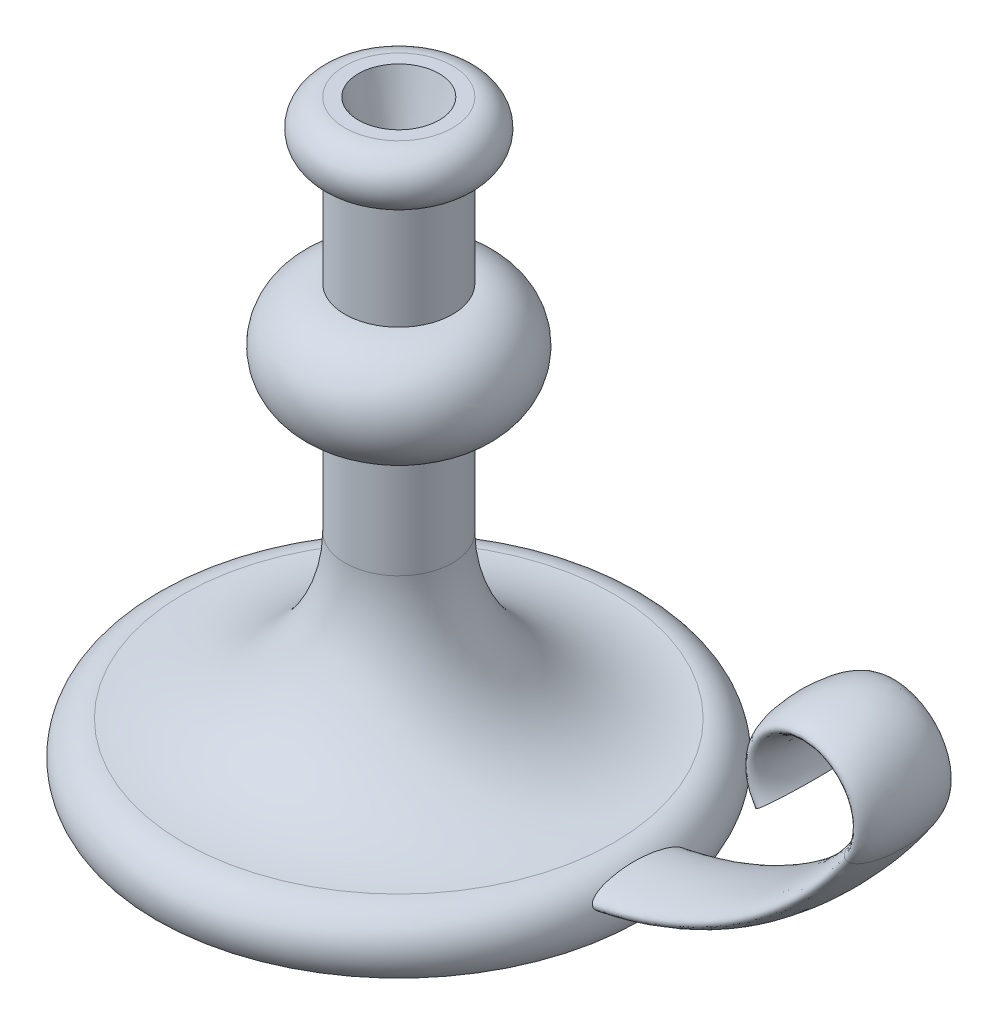
ISO-10303-21;
HEADER;
FILE_DESCRIPTION(('STEP AP214'),'2;1');
FILE_NAME('part.step','',(''),(''),'','','');
FILE_SCHEMA(('AUTOMOTIVE_DESIGN { 1 0 10303 214 1 1 1 1 }'));
ENDSEC;
DATA;
#1=APPLICATION_CONTEXT('core data for automotive mechanical design processes');
#2=APPLICATION_PROTOCOL_DEFINITION('international standard','automotive_design',2000,#1);
#3=PRODUCT_CONTEXT('',#1,'mechanical');
#4=PRODUCT('Part','Part','',(#3));
#5=PRODUCT_RELATED_PRODUCT_CATEGORY('part','',(#4));
#6=PRODUCT_DEFINITION_FORMATION('','',#4);
#7=PRODUCT_DEFINITION_CONTEXT('part definition',#1,'design');
#8=PRODUCT_DEFINITION('design','',#6,#7);
#9=PRODUCT_DEFINITION_SHAPE('','',#8);
#10=(LENGTH_UNIT() NAMED_UNIT(*) SI_UNIT(.MILLI.,.METRE.));
#11=(NAMED_UNIT(*) PLANE_ANGLE_UNIT() SI_UNIT($,.RADIAN.));
#12=(NAMED_UNIT(*) SI_UNIT($,.STERADIAN.) SOLID_ANGLE_UNIT());
#13=UNCERTAINTY_MEASURE_WITH_UNIT(LENGTH_MEASURE(1.E-05),#10,'distance_accuracy_value','');
#14=(GEOMETRIC_REPRESENTATION_CONTEXT(3) GLOBAL_UNCERTAINTY_ASSIGNED_CONTEXT((#13)) GLOBAL_UNIT_ASSIGNED_CONTEXT((#10,
#11,#12)) REPRESENTATION_CONTEXT('',''));
#15=CARTESIAN_POINT('',(0.,0.,0.));
#16=DIRECTION('',(0.,0.,1.));
#17=DIRECTION('',(1.,0.,0.));
#18=AXIS2_PLACEMENT_3D('',#15,#16,#17);
#19=CARTESIAN_POINT('',(0.,0.,0.));
#20=DIRECTION('',(0.,-1.,0.));
#21=DIRECTION('',(0.,0.,-1.));
#22=AXIS2_PLACEMENT_3D('',#19,#20,#21);
#23=PLANE('',#22);
#24=CARTESIAN_POINT('',(0.,0.,0.));
#25=DIRECTION('',(0.,1.,0.));
#26=DIRECTION('',(0.,0.,1.));
#27=AXIS2_PLACEMENT_3D('',#24,#25,#26);
#28=CIRCLE('',#27,15.);
#29=CARTESIAN_POINT('',(0.,0.,15.));
#30=VERTEX_POINT('',#29);
#31=EDGE_CURVE('E73',#30,#30,#28,.T.);
#32=ORIENTED_EDGE('',*,*,#31,.F.);
#33=EDGE_LOOP('',(#32));
#34=FACE_BOUND('',#33,.T.);
#35=CARTESIAN_POINT('',(0.,0.,0.));
#36=DIRECTION('',(0.,1.,0.));
#37=DIRECTION('',(0.,0.,1.));
#38=AXIS2_PLACEMENT_3D('',#35,#36,#37);
#39=CIRCLE('',#38,20.);
#40=CARTESIAN_POINT('',(0.,0.,20.));
#41=VERTEX_POINT('',#40);
#42=EDGE_CURVE('E10',#41,#41,#39,.T.);
#43=ORIENTED_EDGE('',*,*,#42,.T.);
#44=EDGE_LOOP('',(#43));
#45=FACE_BOUND('',#44,.T.);
#46=ADVANCED_FACE('F31',(#34,#45),#23,.F.);
#47=CARTESIAN_POINT('',(0.,-10.,0.));
#48=DIRECTION('',(0.,1.,0.));
#49=DIRECTION('',(0.,0.,1.));
#50=AXIS2_PLACEMENT_3D('',#47,#48,#49);
#51=TOROIDAL_SURFACE('',#50,20.,10.);
#52=ORIENTED_EDGE('',*,*,#42,.F.);
#53=EDGE_LOOP('',(#52));
#54=FACE_BOUND('',#53,.T.);
#55=CARTESIAN_POINT('',(0.,-20.,0.));
#56=DIRECTION('',(0.,1.,0.));
#57=DIRECTION('',(0.,0.,1.));
#58=AXIS2_PLACEMENT_3D('',#55,#56,#57);
#59=CIRCLE('',#58,20.);
#60=CARTESIAN_POINT('',(0.,-20.,20.));
#61=VERTEX_POINT('',#60);
#62=EDGE_CURVE('E43',#61,#61,#59,.T.);
#63=ORIENTED_EDGE('',*,*,#62,.T.);
#64=EDGE_LOOP('',(#63));
#65=FACE_BOUND('',#64,.T.);
#66=ADVANCED_FACE('F80',(#54,#65),#51,.T.);
#67=CARTESIAN_POINT('',(0.,0.,0.));
#68=DIRECTION('',(0.,1.,0.));
#69=DIRECTION('',(0.,0.,1.));
#70=AXIS2_PLACEMENT_3D('',#67,#68,#69);
#71=CYLINDRICAL_SURFACE('',#70,20.);
#72=ORIENTED_EDGE('',*,*,#62,.F.);
#73=EDGE_LOOP('',(#72));
#74=FACE_BOUND('',#73,.T.);
#75=CARTESIAN_POINT('',(0.,-60.,0.));
#76=DIRECTION('',(0.,1.,0.));
#77=DIRECTION('',(0.,0.,1.));
#78=AXIS2_PLACEMENT_3D('',#75,#76,#77);
#79=CIRCLE('',#78,20.);
#80=CARTESIAN_POINT('',(0.,-60.,20.));
#81=VERTEX_POINT('',#80);
#82=EDGE_CURVE('E47',#81,#81,#79,.T.);
#83=ORIENTED_EDGE('',*,*,#82,.T.);
#84=EDGE_LOOP('',(#83));
#85=FACE_BOUND('',#84,.T.);
#86=ADVANCED_FACE('F84',(#74,#85),#71,.T.);
#87=CARTESIAN_POINT('',(0.,-80.,0.));
#88=DIRECTION('',(0.,1.,0.));
#89=DIRECTION('',(0.,0.,1.));
#90=AXIS2_PLACEMENT_3D('',#87,#88,#89);
#91=DEGENERATE_TOROIDAL_SURFACE('',#90,20.,20.,.T.);
#92=ORIENTED_EDGE('',*,*,#82,.F.);
#93=EDGE_LOOP('',(#92));
#94=FACE_BOUND('',#93,.T.);
#95=CARTESIAN_POINT('',(0.,-100.,0.));
#96=DIRECTION('',(0.,1.,0.));
#97=DIRECTION('',(0.,0.,1.));
#98=AXIS2_PLACEMENT_3D('',#95,#96,#97);
#99=CIRCLE('',#98,20.);
#100=CARTESIAN_POINT('',(0.,-100.,20.));
#101=VERTEX_POINT('',#100);
#102=EDGE_CURVE('E52',#101,#101,#99,.T.);
#103=ORIENTED_EDGE('',*,*,#102,.T.);
#104=EDGE_LOOP('',(#103));
#105=FACE_BOUND('',#104,.T.);
#106=ADVANCED_FACE('F89',(#94,#105),#91,.T.);
#107=CARTESIAN_POINT('',(0.,0.,0.));
#108=DIRECTION('',(0.,1.,0.));
#109=DIRECTION('',(0.,0.,1.));
#110=AXIS2_PLACEMENT_3D('',#107,#108,#109);
#111=CYLINDRICAL_SURFACE('',#110,20.);
#112=ORIENTED_EDGE('',*,*,#102,.F.);
#113=EDGE_LOOP('',(#112));
#114=FACE_BOUND('',#113,.T.);
#115=CARTESIAN_POINT('',(0.,-140.,0.));
#116=DIRECTION('',(0.,1.,0.));
#117=DIRECTION('',(0.,0.,1.));
#118=AXIS2_PLACEMENT_3D('',#115,#116,#117);
#119=CIRCLE('',#118,20.);
#120=CARTESIAN_POINT('',(0.,-140.,20.));
#121=VERTEX_POINT('',#120);
#122=EDGE_CURVE('E55',#121,#121,#119,.T.);
#123=ORIENTED_EDGE('',*,*,#122,.T.);
#124=EDGE_LOOP('',(#123));
#125=FACE_BOUND('',#124,.T.);
#126=ADVANCED_FACE('F96',(#114,#125),#111,.T.);
#127=CARTESIAN_POINT('',(0.,-140.,0.));
#128=DIRECTION('',(0.,1.,0.));
#129=DIRECTION('',(0.,0.,1.));
#130=AXIS2_PLACEMENT_3D('',#127,#128,#129);
#131=TOROIDAL_SURFACE('',#130,80.,60.);
#132=ORIENTED_EDGE('',*,*,#122,.F.);
#133=EDGE_LOOP('',(#132));
#134=FACE_BOUND('',#133,.T.);
#135=CARTESIAN_POINT('',(0.,-200.,0.));
#136=DIRECTION('',(0.,1.,0.));
#137=DIRECTION('',(0.,0.,1.));
#138=AXIS2_PLACEMENT_3D('',#135,#136,#137);
#139=CIRCLE('',#138,80.);
#140=CARTESIAN_POINT('',(0.,-200.,80.));
#141=VERTEX_POINT('',#140);
#142=EDGE_CURVE('E58',#141,#141,#139,.T.);
#143=ORIENTED_EDGE('',*,*,#142,.T.);
#144=EDGE_LOOP('',(#143));
#145=FACE_BOUND('',#144,.T.);
#146=ADVANCED_FACE('F100',(#134,#145),#131,.F.);
#147=CARTESIAN_POINT('',(0.,-212.5,0.));
#148=DIRECTION('',(0.,1.,0.));
#149=DIRECTION('',(0.,0.,1.));
#150=AXIS2_PLACEMENT_3D('',#147,#148,#149);
#151=TOROIDAL_SURFACE('',#150,80.,12.5);
#152=CARTESIAN_POINT('',(89.5597422043342,-207.058565343244,-17.5));
#153=CARTESIAN_POINT('',(89.5807278946485,-207.101160684292,-17.5000019534777));
#154=CARTESIAN_POINT('',(89.6018125795404,-207.143696064223,-17.4977816975197));
#155=CARTESIAN_POINT('',(89.6440155813562,-207.228306166063,-17.489002543543));
#156=CARTESIAN_POINT('',(89.6651339056647,-207.270380763928,-17.4824425050804));
#157=CARTESIAN_POINT('',(89.7283289297819,-207.395492340258,-17.4565216692094));
#158=CARTESIAN_POINT('',(89.7702246464785,-207.477374410575,-17.4309204730635));
#159=CARTESIAN_POINT('',(89.8644276523311,-207.659226422803,-17.3563532007826));
#160=CARTESIAN_POINT('',(89.9162117483189,-207.757515098334,-17.3027527423026));
#161=CARTESIAN_POINT('',(90.0163878681401,-207.944854172799,-17.1788263211439));
#162=CARTESIAN_POINT('',(90.0647710548456,-208.033880773007,-17.1084587296402));
#163=CARTESIAN_POINT('',(90.1524531790239,-208.193015477075,-16.965239155148));
#164=CARTESIAN_POINT('',(90.1921458014336,-208.264112100552,-16.8936963434585));
#165=CARTESIAN_POINT('',(90.2690886261225,-208.400374093178,-16.743896948831));
#166=CARTESIAN_POINT('',(90.3063367280021,-208.465534379847,-16.6656347222649));
#167=CARTESIAN_POINT('',(90.3786756485819,-208.590745918489,-16.5039763875563));
#168=CARTESIAN_POINT('',(90.4137624747615,-208.650787789371,-16.4205713158717));
#169=CARTESIAN_POINT('',(90.4819450166472,-208.76631059746,-16.2499454917113));
#170=CARTESIAN_POINT('',(90.5150413047903,-208.821792847617,-16.1627258488088));
#171=CARTESIAN_POINT('',(90.5839705930101,-208.936274817431,-15.9728919395735));
#172=CARTESIAN_POINT('',(90.6195406839563,-208.994684387115,-15.8698282905886));
#173=CARTESIAN_POINT('',(90.688666852627,-209.107085610279,-15.6606649910657));
#174=CARTESIAN_POINT('',(90.7222226971282,-209.161076752426,-15.5545649910505));
#175=CARTESIAN_POINT('',(90.787486486134,-209.265124859688,-15.3401290691864));
#176=CARTESIAN_POINT('',(90.8191972688173,-209.315187910916,-15.2317969483066));
#177=CARTESIAN_POINT('',(90.881005962979,-209.411931661459,-15.0131968985224));
#178=CARTESIAN_POINT('',(90.9111039714558,-209.458612564248,-14.9029290865685));
#179=CARTESIAN_POINT('',(90.9798973633521,-209.56445084829,-14.6427529331224));
#180=CARTESIAN_POINT('',(91.0180072010884,-209.622406334424,-14.4922012075479));
#181=CARTESIAN_POINT('',(91.091887555317,-209.733653710831,-14.1888070722869));
#182=CARTESIAN_POINT('',(91.1276577411368,-209.786944942244,-14.0359643425396));
#183=CARTESIAN_POINT('',(91.1971197458646,-209.889487231039,-13.728268571258));
#184=CARTESIAN_POINT('',(91.2308091946812,-209.93873370149,-13.5734134718708));
#185=CARTESIAN_POINT('',(91.2962483962878,-210.033579554252,-13.2621801041718));
#186=CARTESIAN_POINT('',(91.3279980241889,-210.0791787018,-13.1058017385394));
#187=CARTESIAN_POINT('',(91.4205951755327,-210.211125413392,-12.6346162266683));
#188=CARTESIAN_POINT('',(91.4787589060981,-210.292575230204,-12.317902504244));
#189=CARTESIAN_POINT('',(91.5890957852254,-210.445061738699,-11.67921888986));
#190=CARTESIAN_POINT('',(91.641236506382,-210.516042585741,-11.3572303186107));
#191=CARTESIAN_POINT('',(91.7397682682944,-210.648637788368,-10.7107316640821));
#192=CARTESIAN_POINT('',(91.7861636672357,-210.710259251768,-10.3862236929832));
#193=CARTESIAN_POINT('',(91.8736976604511,-210.82536281682,-9.73512886653547));
#194=CARTESIAN_POINT('',(91.9148370779327,-210.878846193335,-9.40854234516792));
#195=CARTESIAN_POINT('',(91.9930777751442,-210.979687900797,-8.74630339912589));
#196=CARTESIAN_POINT('',(92.0300669877613,-211.026880788628,-8.41061269264312));
#197=CARTESIAN_POINT('',(92.0991833927575,-211.114401575226,-7.73783252743919));
#198=CARTESIAN_POINT('',(92.1313104056236,-211.154729220532,-7.40074301754585));
#199=CARTESIAN_POINT('',(92.1909161961866,-211.229076865607,-6.72537142355319));
#200=CARTESIAN_POINT('',(92.2183937480206,-211.263095202108,-6.38708904887164));
#201=CARTESIAN_POINT('',(92.268848081604,-211.325231596955,-5.70964427774262));
#202=CARTESIAN_POINT('',(92.2918247141675,-211.353349459728,-5.37048185250271));
#203=CARTESIAN_POINT('',(92.3540877228586,-211.429233953695,-4.35367181244639));
#204=CARTESIAN_POINT('',(92.3868571977359,-211.468716616295,-3.67498389641616));
#205=CARTESIAN_POINT('',(92.4356134743348,-211.527258381671,-2.31614711504038));
#206=CARTESIAN_POINT('',(92.4515998737814,-211.546316994903,-1.6359982150679));
#207=CARTESIAN_POINT('',(92.4661200478782,-211.563626607151,-0.357955102331658));
#208=CARTESIAN_POINT('',(92.4665389208555,-211.564125098203,0.239888856143892));
#209=CARTESIAN_POINT('',(92.4546362797528,-211.549937587392,1.43536153859178));
#210=CARTESIAN_POINT('',(92.4423128974783,-211.535249358942,2.0329902181485));
#211=CARTESIAN_POINT('',(92.4047541650815,-211.490233192201,3.22745109478541));
#212=CARTESIAN_POINT('',(92.379514731688,-211.459900307996,3.82428298010717));
#213=CARTESIAN_POINT('',(92.3157217367253,-211.382566797703,5.01694606233243));
#214=CARTESIAN_POINT('',(92.2771508465328,-211.335544476041,5.61277493756107));
#215=CARTESIAN_POINT('',(92.1861026743768,-211.223212157537,6.80153886380907));
#216=CARTESIAN_POINT('',(92.1336290020919,-211.157906907375,7.39447462535054));
#217=CARTESIAN_POINT('',(92.0437550848419,-211.044257727933,8.28055229820468));
#218=CARTESIAN_POINT('',(92.0119455213755,-211.00377105448,8.57528682166678));
#219=CARTESIAN_POINT('',(91.9444204496405,-210.917084602051,9.16346094428831));
#220=CARTESIAN_POINT('',(91.9087051114866,-210.870885071885,9.4569005992666));
#221=CARTESIAN_POINT('',(91.8331309715699,-210.772170706659,10.0422906036677));
#222=CARTESIAN_POINT('',(91.7932707518515,-210.719653709436,10.3342404073462));
#223=CARTESIAN_POINT('',(91.709117916737,-210.607549379184,10.9161852811046));
#224=CARTESIAN_POINT('',(91.6648247441273,-210.54796115714,11.2061801005445));
#225=CARTESIAN_POINT('',(91.5713925727482,-210.420683546661,11.7838191658161));
#226=CARTESIAN_POINT('',(91.5222504482683,-210.352988926631,12.0714617643065));
#227=CARTESIAN_POINT('',(91.4186796874407,-210.208272699141,12.6430805537623));
#228=CARTESIAN_POINT('',(91.3642572573636,-210.131262015759,12.9270606150346));
#229=CARTESIAN_POINT('',(91.2493765391176,-209.966047025212,13.4904217181457));
#230=CARTESIAN_POINT('',(91.1889212109099,-209.877848201655,13.7698049377439));
#231=CARTESIAN_POINT('',(91.0929373870876,-209.735172511764,14.1839125047637));
#232=CARTESIAN_POINT('',(91.0600757486264,-209.685909581815,14.3210581267377));
#233=CARTESIAN_POINT('',(90.9923938569388,-209.583448897281,14.593376347764));
#234=CARTESIAN_POINT('',(90.9575737807139,-209.530251498152,14.7285491237335));
#235=CARTESIAN_POINT('',(90.8810851838779,-209.412154865592,15.0138774923669));
#236=CARTESIAN_POINT('',(90.8391147723959,-209.346633379159,15.1636969104741));
#237=CARTESIAN_POINT('',(90.7519625692613,-209.208781022819,15.4593295355895));
#238=CARTESIAN_POINT('',(90.7067794219569,-209.136447274169,15.6051410149845));
#239=CARTESIAN_POINT('',(90.6128939496975,-208.983956037032,15.8905749729621));
#240=CARTESIAN_POINT('',(90.5642084544311,-208.903835389431,16.0302224467124));
#241=CARTESIAN_POINT('',(90.4624897667353,-208.733746989213,16.3016394850688));
#242=CARTESIAN_POINT('',(90.4094613083906,-208.643789923932,16.4334173639365));
#243=CARTESIAN_POINT('',(90.3114276481004,-208.474491461495,16.6553108138961));
#244=CARTESIAN_POINT('',(90.2675273757816,-208.397739110939,16.7478644471361));
#245=CARTESIAN_POINT('',(90.1761749534326,-208.235670776131,16.9236630994732));
#246=CARTESIAN_POINT('',(90.1287172073379,-208.150341224507,17.0068929161981));
#247=CARTESIAN_POINT('',(90.0292807633427,-207.968670820263,17.1607281219249));
#248=CARTESIAN_POINT('',(89.9772518064338,-207.872202559265,17.231157538909));
#249=CARTESIAN_POINT('',(89.8965437818879,-207.719938601206,17.3212876850734));
#250=CARTESIAN_POINT('',(89.8692277989254,-207.667983584687,17.348724213216));
#251=CARTESIAN_POINT('',(89.8138320311433,-207.561704483153,17.3975211145678));
#252=CARTESIAN_POINT('',(89.7857527202503,-207.50738185602,17.4188851676709));
#253=CARTESIAN_POINT('',(89.7185869780337,-207.376295199441,17.4611772226901));
#254=CARTESIAN_POINT('',(89.6792533408888,-207.298630777573,17.4790502108362));
#255=CARTESIAN_POINT('',(89.6005512815566,-207.141374366052,17.4997317533412));
#256=CARTESIAN_POINT('',(89.5611829132235,-207.061783986005,17.5025524785485));
#257=CARTESIAN_POINT('',(89.4835317885698,-206.903036657676,17.4927372657774));
#258=CARTESIAN_POINT('',(89.4452490812938,-206.823879729104,17.4801006306501));
#259=CARTESIAN_POINT('',(89.3707047667357,-206.668192822544,17.4406494077291));
#260=CARTESIAN_POINT('',(89.3344452993773,-206.591665657647,17.413820111618));
#261=CARTESIAN_POINT('',(89.2510611220236,-206.414144561432,17.3357126521073));
#262=CARTESIAN_POINT('',(89.2050998650833,-206.315017622278,17.2790047620842));
#263=CARTESIAN_POINT('',(89.1180744174558,-206.125572368818,17.1491670423829));
#264=CARTESIAN_POINT('',(89.0770301058261,-206.035290064332,17.0759737821301));
#265=CARTESIAN_POINT('',(89.0037033744713,-205.872856514243,16.9270577307043));
#266=CARTESIAN_POINT('',(88.9709541551905,-205.799805431927,16.852520870899));
#267=CARTESIAN_POINT('',(88.9084968426192,-205.659818830956,16.6970292692115));
#268=CARTESIAN_POINT('',(88.8787841266136,-205.592874033424,16.6160846261898));
#269=CARTESIAN_POINT('',(88.8217814388551,-205.464000436912,16.4490709627685));
#270=CARTESIAN_POINT('',(88.7944998605829,-205.402089075759,16.3629857823218));
#271=CARTESIAN_POINT('',(88.7420667437372,-205.282826593535,16.187069787364));
#272=CARTESIAN_POINT('',(88.7169159331095,-205.22547703134,16.097237708296));
#273=CARTESIAN_POINT('',(88.6682699235339,-205.114410090949,15.9140699306473));
#274=CARTESIAN_POINT('',(88.6447869137159,-205.060719551058,15.820714827907));
#275=CARTESIAN_POINT('',(88.599397193943,-204.956899115613,15.6316626961445));
#276=CARTESIAN_POINT('',(88.5774907604161,-204.906769844491,15.5359652603538));
#277=CARTESIAN_POINT('',(88.5137514786224,-204.760971412582,15.2458062448803));
#278=CARTESIAN_POINT('',(88.4739596847916,-204.670031452265,15.0485147207865));
#279=CARTESIAN_POINT('',(88.3985337506618,-204.498222479638,14.6487152633408));
#280=CARTESIAN_POINT('',(88.3629029634844,-204.417361585997,14.4462032813495));
#281=CARTESIAN_POINT('',(88.2948356711216,-204.263693387134,14.0365764701714));
#282=CARTESIAN_POINT('',(88.2624142295173,-204.190923880019,13.8294450545376));
#283=CARTESIAN_POINT('',(88.2003835751386,-204.052635119805,13.4126289871789));
#284=CARTESIAN_POINT('',(88.1707714189818,-203.987108266179,13.2029472733613));
#285=CARTESIAN_POINT('',(88.1139049361942,-203.862262425439,12.7814949946334));
#286=CARTESIAN_POINT('',(88.0866500408512,-203.802941940251,12.5697249473662));
#287=CARTESIAN_POINT('',(88.0276172572034,-203.67557643377,12.0912931700815));
#288=CARTESIAN_POINT('',(87.9964138193049,-203.609061873452,11.8241540502383));
#289=CARTESIAN_POINT('',(87.9367717636622,-203.483406323529,11.2878278414691));
#290=CARTESIAN_POINT('',(87.9083334164426,-203.424266055235,11.0186405549316));
#291=CARTESIAN_POINT('',(87.8539266282976,-203.312490105105,10.4785408424928));
#292=CARTESIAN_POINT('',(87.8279593730492,-203.259857542201,10.207627654324));
#293=CARTESIAN_POINT('',(87.7783184309336,-203.160469847707,9.6645116800033));
#294=CARTESIAN_POINT('',(87.7546448506401,-203.113714989189,9.39230883454442));
#295=CARTESIAN_POINT('',(87.6869994555329,-202.981719694906,8.57578965922354));
#296=CARTESIAN_POINT('',(87.646238852585,-202.904414599632,8.02991167226052));
#297=CARTESIAN_POINT('',(87.5728065515615,-202.767985431271,6.93552385094661));
#298=CARTESIAN_POINT('',(87.5401330675687,-202.708857343368,6.38701462498779));
#299=CARTESIAN_POINT('',(87.4828441952975,-202.606912387903,5.28955884851657));
#300=CARTESIAN_POINT('',(87.4582074588684,-202.564052257068,4.74061740413343));
#301=CARTESIAN_POINT('',(87.4169410999175,-202.49311150653,3.64146108219597));
#302=CARTESIAN_POINT('',(87.4003119088605,-202.465031683217,3.09124613762721));
#303=CARTESIAN_POINT('',(87.3751699481991,-202.422843353798,1.98980868970216));
#304=CARTESIAN_POINT('',(87.3666614689745,-202.408742232847,1.43858580773162));
#305=CARTESIAN_POINT('',(87.3578539704596,-202.39414881594,0.335909067656601));
#306=CARTESIAN_POINT('',(87.3575547550007,-202.393656194796,-0.215544784613699));
#307=CARTESIAN_POINT('',(87.3651677510507,-202.406264783748,-1.31815822775013));
#308=CARTESIAN_POINT('',(87.3730787250642,-202.4193639452,-1.8693178504383));
#309=CARTESIAN_POINT('',(87.3970372477739,-202.459513170725,-2.97097544676394));
#310=CARTESIAN_POINT('',(87.4130850653534,-202.486563695823,-3.52147339793376));
#311=CARTESIAN_POINT('',(87.4531996813076,-202.555378617242,-4.62112135665365));
#312=CARTESIAN_POINT('',(87.4772644593785,-202.597139306697,-5.17027166872684));
#313=CARTESIAN_POINT('',(87.5333316774053,-202.696629238725,-6.26670053622011));
#314=CARTESIAN_POINT('',(87.5653334299473,-202.754357098447,-6.81397924957832));
#315=CARTESIAN_POINT('',(87.6208220531221,-202.85709504909,-7.65503321382223));
#316=CARTESIAN_POINT('',(87.6414679669249,-202.895766675324,-7.94978028807391));
#317=CARTESIAN_POINT('',(87.6851649593445,-202.978774929843,-8.5382946276081));
#318=CARTESIAN_POINT('',(87.7082159678739,-203.023111393055,-8.83206192118528));
#319=CARTESIAN_POINT('',(87.7568106691326,-203.11794896303,-9.41827197235602));
#320=CARTESIAN_POINT('',(87.7823533405991,-203.168447546223,-9.71071522163591));
#321=CARTESIAN_POINT('',(87.8360989952255,-203.276280631893,-10.2940938312635));
#322=CARTESIAN_POINT('',(87.8643018909546,-203.333614909724,-10.5850292408365));
#323=CARTESIAN_POINT('',(87.9147712499537,-203.437715738947,-11.078452988712));
#324=CARTESIAN_POINT('',(87.9362980252943,-203.482530810019,-11.2814293835234));
#325=CARTESIAN_POINT('',(87.9809118301293,-203.576316486523,-11.686245562298));
#326=CARTESIAN_POINT('',(88.0039988123343,-203.625286966017,-11.8880853805099));
#327=CARTESIAN_POINT('',(88.0519198244932,-203.727878461522,-12.2905621648757));
#328=CARTESIAN_POINT('',(88.0767553337313,-203.781503424455,-12.4911979528329));
#329=CARTESIAN_POINT('',(88.1283787004657,-203.893929215264,-12.8907612736758));
#330=CARTESIAN_POINT('',(88.1551664933013,-203.952729871731,-13.0896888628943));
#331=CARTESIAN_POINT('',(88.2109999780494,-204.07622817944,-13.4854201231338));
#332=CARTESIAN_POINT('',(88.2400459194848,-204.140926482501,-13.6822235566939));
#333=CARTESIAN_POINT('',(88.3008027999422,-204.277130806412,-14.0730419872829));
#334=CARTESIAN_POINT('',(88.3325134779574,-204.348636160613,-14.2670572552334));
#335=CARTESIAN_POINT('',(88.3991424541949,-204.499605188412,-14.6511973591074));
#336=CARTESIAN_POINT('',(88.4340575115805,-204.579060828455,-14.84132589306));
#337=CARTESIAN_POINT('',(88.5079196083037,-204.747615123741,-15.2164401400112));
#338=CARTESIAN_POINT('',(88.5468648114117,-204.836709388232,-15.4014281468436));
#339=CARTESIAN_POINT('',(88.609209623884,-204.97934202811,-15.6733114229593));
#340=CARTESIAN_POINT('',(88.6306485895091,-205.028391325995,-15.7630166800324));
#341=CARTESIAN_POINT('',(88.6750422753303,-205.129875138476,-15.9401002079334));
#342=CARTESIAN_POINT('',(88.6979967332487,-205.182309067278,-16.0274788777563));
#343=CARTESIAN_POINT('',(88.745684010179,-205.291052115571,-16.1993887567103));
#344=CARTESIAN_POINT('',(88.7704179688263,-205.347363717409,-16.2839180892515));
#345=CARTESIAN_POINT('',(88.8219484857473,-205.464357738208,-16.4492391224732));
#346=CARTESIAN_POINT('',(88.8487445345043,-205.525039077224,-16.5300317386012));
#347=CARTESIAN_POINT('',(88.8976102788182,-205.635256515104,-16.6667168433035));
#348=CARTESIAN_POINT('',(88.9191374191604,-205.683676967791,-16.723695533493));
#349=CARTESIAN_POINT('',(88.9637080676462,-205.783554701783,-16.8342912802658));
#350=CARTESIAN_POINT('',(88.9867519478507,-205.835012727892,-16.8879075056802));
#351=CARTESIAN_POINT('',(89.0583610181494,-205.994199178319,-17.0423310846541));
#352=CARTESIAN_POINT('',(89.1095289234097,-206.107024158303,-17.137079610971));
#353=CARTESIAN_POINT('',(89.1999001554567,-206.303661379101,-17.2707956184653));
#354=CARTESIAN_POINT('',(89.2367505169314,-206.38323551203,-17.317550348062));
#355=CARTESIAN_POINT('',(89.3136877653842,-206.547702583397,-17.3968468737178));
#356=CARTESIAN_POINT('',(89.3537667767858,-206.632582472602,-17.4294220837175));
#357=CARTESIAN_POINT('',(89.4217091217886,-206.774815102644,-17.468596733668));
#358=CARTESIAN_POINT('',(89.4488093840975,-206.831144828381,-17.4803204652973));
#359=CARTESIAN_POINT('',(89.5037947740347,-206.944540506502,-17.4960211898047));
#360=CARTESIAN_POINT('',(89.5316799818998,-207.001606533826,-17.4999973877949));
#361=CARTESIAN_POINT('',(89.5597422043342,-207.058565343244,-17.5));
#362=B_SPLINE_CURVE_WITH_KNOTS('',3,(#152,#153,#154,#155,#156,#157,#158,#159,#160,#161,#162,
#163,#164,#165,#166,#167,#168,#169,#170,#171,#172,#173,#174,#175,#176,#177,#178,#179,#180,#181,
#182,#183,#184,#185,#186,#187,#188,#189,#190,#191,#192,#193,#194,#195,#196,#197,#198,#199,#200,
#201,#202,#203,#204,#205,#206,#207,#208,#209,#210,#211,#212,#213,#214,#215,#216,#217,#218,#219,
#220,#221,#222,#223,#224,#225,#226,#227,#228,#229,#230,#231,#232,#233,#234,#235,#236,#237,#238,
#239,#240,#241,#242,#243,#244,#245,#246,#247,#248,#249,#250,#251,#252,#253,#254,#255,#256,#257,
#258,#259,#260,#261,#262,#263,#264,#265,#266,#267,#268,#269,#270,#271,#272,#273,#274,#275,#276,
#277,#278,#279,#280,#281,#282,#283,#284,#285,#286,#287,#288,#289,#290,#291,#292,#293,#294,#295,
#296,#297,#298,#299,#300,#301,#302,#303,#304,#305,#306,#307,#308,#309,#310,#311,#312,#313,#314,
#315,#316,#317,#318,#319,#320,#321,#322,#323,#324,#325,#326,#327,#328,#329,#330,#331,#332,#333,
#334,#335,#336,#337,#338,#339,#340,#341,#342,#343,#344,#345,#346,#347,#348,#349,#350,#351,#352,
#353,#354,#355,#356,#357,#358,#359,#360,#361),.UNSPECIFIED.,.T.,.F.,(4,2,2,2,2,2,2,2,2,2,2,2,2,
2,2,2,2,2,2,2,2,2,2,2,2,2,2,2,2,2,2,2,2,2,2,2,2,2,2,2,2,2,2,2,2,2,2,2,2,2,2,2,2,2,2,2,2,2,2,2,2,
2,2,2,2,2,2,2,2,2,2,2,2,2,2,2,2,2,2,2,2,2,2,2,2,2,2,2,2,2,2,2,2,2,2,2,2,2,2,2,2,2,2,2,4),(0.,
0.142381357158825,0.284800145338821,0.56977836971042,0.937790990160542,1.30672699797608,
1.6314335332856,1.95641550824181,2.28198085179487,2.60745211744541,2.97835758825758,
3.34930592253155,3.71966767593586,4.09000712931077,4.58717127025791,5.08440552627617,
5.58219609730437,6.08001868322221,7.07612740491166,8.07737111401434,9.07785060328497,
10.0781732018632,11.1010679437464,12.1240004418371,13.147202224441,14.1704379160045,
16.2117115539477,18.2530341182276,20.0462457692421,21.839720367684,23.6337623045225,
25.4301450150662,27.226061774197,28.1235892294172,29.0210776086997,29.918874033384,
30.8167834514314,31.7152755049912,32.6127240115708,33.5097343418993,33.9578247270804,
34.4058746792318,34.912160474793,35.4186611861165,35.9228725276491,36.4265413835621,
36.8100240505596,37.1941231504198,37.5831580539589,37.7772586450037,37.9712413599163,
38.2366258142312,38.5017956533795,38.7669774525065,39.0324346081144,39.3996555983544,
39.7683144393115,40.0959866375232,40.4231523204119,40.7514069982202,41.0797733710065,
41.4103344436365,41.7409533344636,42.4030339566249,43.0656444835707,43.7312306850922,
44.3961116446121,45.0608317450465,45.8918608553035,46.7229711882452,47.5544783139703,
48.3860240564092,50.0440426041108,51.7016946762934,53.3549069476098,55.0082082878354,
56.6623826267226,58.3165174374061,59.9704029618793,61.6243431428064,63.2778668395486,
64.931247376151,65.825161771726,66.7190501248559,67.6125736254088,68.5060677696727,
69.1329546330565,69.75982250422,70.3872272415006,71.0146112082135,71.6420645989439,
72.2694566030588,72.8962209263384,73.5227009279454,73.8360175198341,74.1492800292257,
74.4627449766564,74.7761327179471,75.0094189443169,75.2427626113319,75.7080186392192,
76.005244146509,76.301765401322,76.4921392885507,76.6825327068867),.UNSPECIFIED.);
#363=CARTESIAN_POINT('',(89.5597422043342,-207.058565343244,-17.5));
#364=VERTEX_POINT('',#363);
#365=EDGE_CURVE('E34',#364,#364,#362,.T.);
#366=ORIENTED_EDGE('',*,*,#365,.T.);
#367=EDGE_LOOP('',(#366));
#368=FACE_BOUND('',#367,.T.);
#369=ORIENTED_EDGE('',*,*,#142,.F.);
#370=EDGE_LOOP('',(#369));
#371=FACE_BOUND('',#370,.T.);
#372=CARTESIAN_POINT('',(0.,-220.,0.));
#373=DIRECTION('',(0.,1.,0.));
#374=DIRECTION('',(0.,0.,1.));
#375=AXIS2_PLACEMENT_3D('',#372,#373,#374);
#376=CIRCLE('',#375,90.);
#377=CARTESIAN_POINT('',(0.,-220.,90.));
#378=VERTEX_POINT('',#377);
#379=EDGE_CURVE('E61',#378,#378,#376,.T.);
#380=ORIENTED_EDGE('',*,*,#379,.T.);
#381=EDGE_LOOP('',(#380));
#382=FACE_BOUND('',#381,.T.);
#383=ADVANCED_FACE('F103',(#368,#371,#382),#151,.T.);
#384=CARTESIAN_POINT('',(0.,-220.,0.));
#385=DIRECTION('',(0.,1.,0.));
#386=DIRECTION('',(0.,0.,1.));
#387=AXIS2_PLACEMENT_3D('',#384,#385,#386);
#388=PLANE('',#387);
#389=ORIENTED_EDGE('',*,*,#379,.F.);
#390=EDGE_LOOP('',(#389));
#391=FACE_BOUND('',#390,.T.);
#392=ADVANCED_FACE('F108',(#391),#388,.F.);
#393=CARTESIAN_POINT('',(60.,-210.,-17.5));
#394=CARTESIAN_POINT('',(110.410191303973,-210.,-17.5));
#395=CARTESIAN_POINT('',(155.026295870831,-186.535332932634,-17.5));
#396=CARTESIAN_POINT('',(183.592070943083,-145.,-17.5));
#397=CARTESIAN_POINT('',(60.,-200.,-17.5));
#398=CARTESIAN_POINT('',(107.049511883708,-200.,-17.5));
#399=CARTESIAN_POINT('',(148.691209479443,-178.099644070458,-17.5));
#400=CARTESIAN_POINT('',(175.352599546877,-139.333333333333,-17.5));
#401=CARTESIAN_POINT('',(60.,-200.,17.5));
#402=CARTESIAN_POINT('',(107.049511883708,-200.,17.5));
#403=CARTESIAN_POINT('',(148.691209479443,-178.099644070458,17.5));
#404=CARTESIAN_POINT('',(175.352599546877,-139.333333333333,17.5));
#405=CARTESIAN_POINT('',(60.,-210.,17.5));
#406=CARTESIAN_POINT('',(110.410191303973,-210.,17.5));
#407=CARTESIAN_POINT('',(155.026295870831,-186.535332932634,17.5));
#408=CARTESIAN_POINT('',(183.592070943083,-145.,17.5));
#409=CARTESIAN_POINT('',(60.,-220.,17.5));
#410=CARTESIAN_POINT('',(113.770870724238,-220.,17.5));
#411=CARTESIAN_POINT('',(161.36138226222,-194.971021794809,17.5));
#412=CARTESIAN_POINT('',(191.831542339288,-150.666666666667,17.5));
#413=CARTESIAN_POINT('',(60.,-220.,-17.5));
#414=CARTESIAN_POINT('',(113.770870724238,-220.,-17.5));
#415=CARTESIAN_POINT('',(161.36138226222,-194.971021794809,-17.5));
#416=CARTESIAN_POINT('',(191.831542339288,-150.666666666667,-17.5));
#417=CARTESIAN_POINT('',(60.,-210.,-17.5));
#418=CARTESIAN_POINT('',(110.410191303973,-210.,-17.5));
#419=CARTESIAN_POINT('',(155.026295870831,-186.535332932634,-17.5));
#420=CARTESIAN_POINT('',(183.592070943083,-145.,-17.5));
#421=(BOUNDED_SURFACE() B_SPLINE_SURFACE(3,3,((#393,#394,#395,#396),(#397,#398,#399,#400),(#401,
#402,#403,#404),(#405,#406,#407,#408),(#409,#410,#411,#412),(#413,#414,#415,#416),(#417,#418,
#419,#420)),.UNSPECIFIED.,.T.,.F.,.F.) B_SPLINE_SURFACE_WITH_KNOTS((4,3,4),(4,4),(0.,0.5,1.),
(0.,1.),.UNSPECIFIED.) GEOMETRIC_REPRESENTATION_ITEM() RATIONAL_B_SPLINE_SURFACE(((1.,
0.923374135437856,0.923374135437856,1.),(0.333333333333333,0.307791378479285,0.307791378479285,
0.333333333333333),(0.333333333333333,0.307791378479285,0.307791378479285,0.333333333333333),
(1.,0.923374135437856,0.923374135437856,1.),(0.333333333333333,0.307791378479285,
0.307791378479285,0.333333333333333),(0.333333333333333,0.307791378479285,0.307791378479285,
0.333333333333333),(1.,0.923374135437856,0.923374135437856,1.))) REPRESENTATION_ITEM('') SURFACE());
#422=CARTESIAN_POINT('',(183.592070943083,-145.,0.));
#423=DIRECTION('',(0.566666666666667,0.823947139620552,0.));
#424=DIRECTION('',(0.,0.,-1.));
#425=AXIS2_PLACEMENT_3D('',#422,#423,#424);
#426=ELLIPSE('',#425,17.5,4.99999999999998);
#427=CARTESIAN_POINT('',(183.592070943083,-145.,-17.5));
#428=VERTEX_POINT('',#427);
#429=EDGE_CURVE('E67',#428,#428,#426,.T.);
#430=ORIENTED_EDGE('',*,*,#429,.F.);
#431=EDGE_LOOP('',(#430));
#432=FACE_BOUND('',#431,.T.);
#433=ORIENTED_EDGE('',*,*,#365,.F.);
#434=EDGE_LOOP('',(#433));
#435=FACE_BOUND('',#434,.T.);
#436=ADVANCED_FACE('F112',(#432,#435),#421,.T.);
#437=CARTESIAN_POINT('',(150.634185358261,-145.,0.));
#438=DIRECTION('',(0.566666666666665,-0.823947139620553,0.));
#439=DIRECTION('',(0.,0.,-1.));
#440=AXIS2_PLACEMENT_3D('',#437,#438,#439);
#441=PLANE('',#440);
#442=CARTESIAN_POINT('',(150.634185358261,-145.,0.));
#443=DIRECTION('',(0.566666666666665,-0.823947139620553,0.));
#444=DIRECTION('',(0.,0.,-1.));
#445=AXIS2_PLACEMENT_3D('',#442,#443,#444);
#446=ELLIPSE('',#445,17.5,4.99999999999998);
#447=CARTESIAN_POINT('',(150.634185358261,-145.,-17.5));
#448=VERTEX_POINT('',#447);
#449=EDGE_CURVE('E64',#448,#448,#446,.T.);
#450=ORIENTED_EDGE('',*,*,#449,.T.);
#451=EDGE_LOOP('',(#450));
#452=FACE_BOUND('',#451,.T.);
#453=ADVANCED_FACE('F114',(#452),#441,.T.);
#454=CARTESIAN_POINT('',(183.592070943083,-145.,-17.5));
#455=CARTESIAN_POINT('',(193.981461744242,-129.89357264762,-17.5));
#456=CARTESIAN_POINT('',(185.447347211541,-113.666666666667,-17.5));
#457=CARTESIAN_POINT('',(167.113128150672,-113.666666666667,-17.5));
#458=CARTESIAN_POINT('',(148.778909089802,-113.666666666667,-17.5));
#459=CARTESIAN_POINT('',(140.244794557101,-129.89357264762,-17.5));
#460=CARTESIAN_POINT('',(150.634185358261,-145.,-17.5));
#461=CARTESIAN_POINT('',(175.352599546877,-139.333333333333,-17.5));
#462=CARTESIAN_POINT('',(180.547294947457,-131.780119657143,-17.5));
#463=CARTESIAN_POINT('',(176.280237681107,-123.666666666667,-17.5));
#464=CARTESIAN_POINT('',(167.113128150672,-123.666666666667,-17.5));
#465=CARTESIAN_POINT('',(157.946018620237,-123.666666666667,-17.5));
#466=CARTESIAN_POINT('',(153.678961353886,-131.780119657143,-17.5));
#467=CARTESIAN_POINT('',(158.873656754466,-139.333333333333,-17.5));
#468=CARTESIAN_POINT('',(175.352599546877,-139.333333333333,17.5));
#469=CARTESIAN_POINT('',(180.547294947457,-131.780119657143,17.5));
#470=CARTESIAN_POINT('',(176.280237681107,-123.666666666667,17.5));
#471=CARTESIAN_POINT('',(167.113128150672,-123.666666666667,17.5));
#472=CARTESIAN_POINT('',(157.946018620237,-123.666666666667,17.5));
#473=CARTESIAN_POINT('',(153.678961353886,-131.780119657143,17.5));
#474=CARTESIAN_POINT('',(158.873656754466,-139.333333333333,17.5));
#475=CARTESIAN_POINT('',(183.592070943083,-145.,17.5));
#476=CARTESIAN_POINT('',(193.981461744242,-129.89357264762,17.5));
#477=CARTESIAN_POINT('',(185.447347211541,-113.666666666667,17.5));
#478=CARTESIAN_POINT('',(167.113128150672,-113.666666666667,17.5));
#479=CARTESIAN_POINT('',(148.778909089802,-113.666666666667,17.5));
#480=CARTESIAN_POINT('',(140.244794557101,-129.89357264762,17.5));
#481=CARTESIAN_POINT('',(150.634185358261,-145.,17.5));
#482=CARTESIAN_POINT('',(191.831542339288,-150.666666666667,17.5));
#483=CARTESIAN_POINT('',(207.415628541027,-128.007025638097,17.5));
#484=CARTESIAN_POINT('',(194.614456741976,-103.666666666667,17.5));
#485=CARTESIAN_POINT('',(167.113128150672,-103.666666666667,17.5));
#486=CARTESIAN_POINT('',(139.611799559367,-103.666666666667,17.5));
#487=CARTESIAN_POINT('',(126.810627760316,-128.007025638096,17.5));
#488=CARTESIAN_POINT('',(142.394713962055,-150.666666666667,17.5));
#489=CARTESIAN_POINT('',(191.831542339288,-150.666666666667,-17.5));
#490=CARTESIAN_POINT('',(207.415628541027,-128.007025638097,-17.5));
#491=CARTESIAN_POINT('',(194.614456741976,-103.666666666667,-17.5));
#492=CARTESIAN_POINT('',(167.113128150672,-103.666666666667,-17.5));
#493=CARTESIAN_POINT('',(139.611799559367,-103.666666666667,-17.5));
#494=CARTESIAN_POINT('',(126.810627760316,-128.007025638096,-17.5));
#495=CARTESIAN_POINT('',(142.394713962055,-150.666666666667,-17.5));
#496=CARTESIAN_POINT('',(183.592070943083,-145.,-17.5));
#497=CARTESIAN_POINT('',(193.981461744242,-129.89357264762,-17.5));
#498=CARTESIAN_POINT('',(185.447347211541,-113.666666666667,-17.5));
#499=CARTESIAN_POINT('',(167.113128150672,-113.666666666667,-17.5));
#500=CARTESIAN_POINT('',(148.778909089802,-113.666666666667,-17.5));
#501=CARTESIAN_POINT('',(140.244794557101,-129.89357264762,-17.5));
#502=CARTESIAN_POINT('',(150.634185358261,-145.,-17.5));
#503=(BOUNDED_SURFACE() B_SPLINE_SURFACE(3,3,((#454,#455,#456,#457,#458,#459,#460),(#461,#462,
#463,#464,#465,#466,#467),(#468,#469,#470,#471,#472,#473,#474),(#475,#476,#477,#478,#479,#480,
#481),(#482,#483,#484,#485,#486,#487,#488),(#489,#490,#491,#492,#493,#494,#495),(#496,#497,#498,
#499,#500,#501,#502)),.UNSPECIFIED.,.T.,.F.,.F.) B_SPLINE_SURFACE_WITH_KNOTS((4,3,4),(4,3,4),
(0.,0.5,1.),(0.,0.5,1.),
.UNSPECIFIED.) GEOMETRIC_REPRESENTATION_ITEM() RATIONAL_B_SPLINE_SURFACE(((1.,0.643649778750421,
0.643649778750421,1.,0.643649778750421,0.643649778750421,1.),(0.333333333333333,
0.21454992625014,0.21454992625014,0.333333333333333,0.21454992625014,0.21454992625014,
0.333333333333333),(0.333333333333333,0.21454992625014,0.21454992625014,0.333333333333333,
0.21454992625014,0.21454992625014,0.333333333333333),(1.,0.643649778750421,0.643649778750421,1.,
0.643649778750421,0.643649778750421,1.),(0.333333333333333,0.21454992625014,0.21454992625014,
0.333333333333333,0.21454992625014,0.21454992625014,0.333333333333333),(0.333333333333333,
0.21454992625014,0.21454992625014,0.333333333333333,0.21454992625014,0.21454992625014,
0.333333333333333),(1.,0.643649778750421,0.643649778750421,1.,0.643649778750421,
0.643649778750421,1.))) REPRESENTATION_ITEM('') SURFACE());
#504=ORIENTED_EDGE('',*,*,#449,.F.);
#505=EDGE_LOOP('',(#504));
#506=FACE_BOUND('',#505,.T.);
#507=ORIENTED_EDGE('',*,*,#429,.T.);
#508=EDGE_LOOP('',(#507));
#509=FACE_BOUND('',#508,.T.);
#510=ADVANCED_FACE('F117',(#506,#509),#503,.T.);
#511=CARTESIAN_POINT('',(0.,0.,0.));
#512=DIRECTION('',(0.,1.,0.));
#513=DIRECTION('',(0.,0.,1.));
#514=AXIS2_PLACEMENT_3D('',#511,#512,#513);
#515=CONICAL_SURFACE('',#514,15.,0.26179938779915);
#516=CARTESIAN_POINT('',(0.,-25.,0.));
#517=DIRECTION('',(0.,1.,0.));
#518=DIRECTION('',(0.,0.,1.));
#519=AXIS2_PLACEMENT_3D('',#516,#517,#518);
#520=CIRCLE('',#519,8.30127018922192);
#521=CARTESIAN_POINT('',(0.,-25.,8.30127018922192));
#522=VERTEX_POINT('',#521);
#523=EDGE_CURVE('E70',#522,#522,#520,.T.);
#524=ORIENTED_EDGE('',*,*,#523,.F.);
#525=EDGE_LOOP('',(#524));
#526=FACE_BOUND('',#525,.T.);
#527=ORIENTED_EDGE('',*,*,#31,.T.);
#528=EDGE_LOOP('',(#527));
#529=FACE_BOUND('',#528,.T.);
#530=ADVANCED_FACE('F77',(#526,#529),#515,.F.);
#531=CARTESIAN_POINT('',(0.,-25.,0.));
#532=DIRECTION('',(0.,1.,0.));
#533=DIRECTION('',(0.,0.,1.));
#534=AXIS2_PLACEMENT_3D('',#531,#532,#533);
#535=PLANE('',#534);
#536=ORIENTED_EDGE('',*,*,#523,.T.);
#537=EDGE_LOOP('',(#536));
#538=FACE_BOUND('',#537,.T.);
#539=ADVANCED_FACE('F141',(#538),#535,.T.);
#540=CLOSED_SHELL('',(#46,#66,#86,#106,#126,#146,#383,#392,#436,#453,#510,#530,#539));
#541=MANIFOLD_SOLID_BREP('B2',#540);
#542=ADVANCED_BREP_SHAPE_REPRESENTATION('',(#18,#541),#14);
#543=SHAPE_DEFINITION_REPRESENTATION(#9,#542);
ENDSEC;
END-ISO-10303-21;
